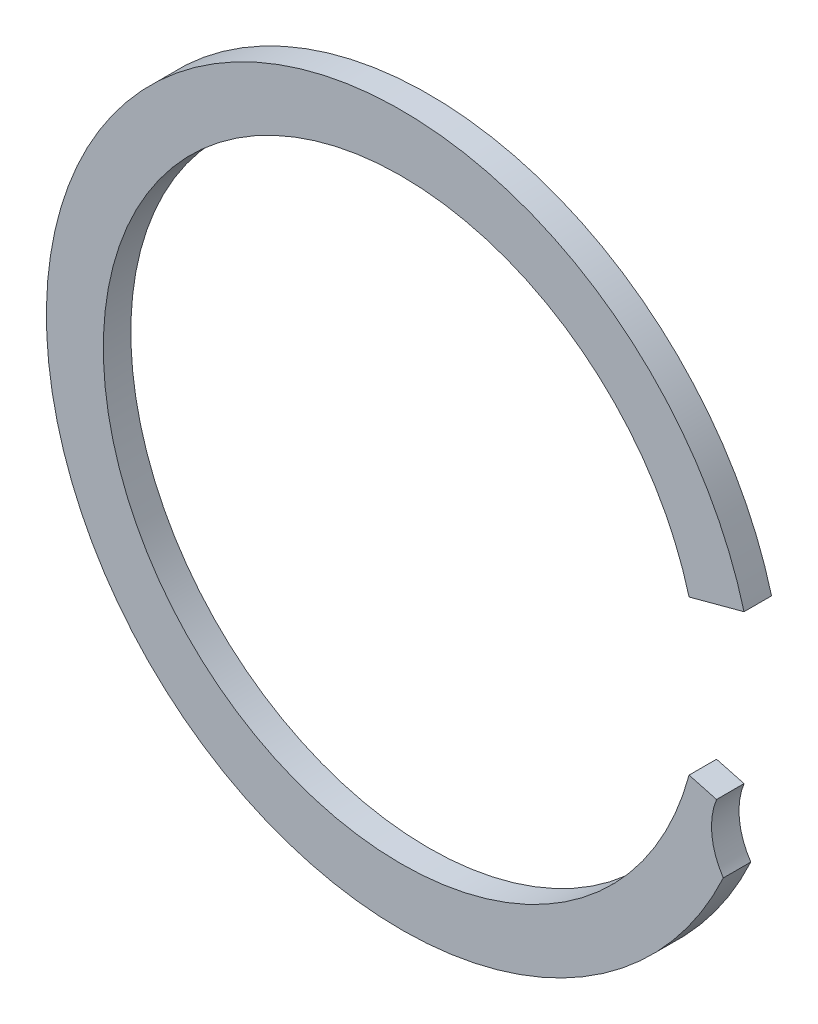
ISO-10303-21;
HEADER;
FILE_DESCRIPTION(('STEP AP214'),'2;1');
FILE_NAME('part.step','',(''),(''),'','','');
FILE_SCHEMA(('AUTOMOTIVE_DESIGN { 1 0 10303 214 1 1 1 1 }'));
ENDSEC;
DATA;
#1=APPLICATION_CONTEXT('core data for automotive mechanical design processes');
#2=APPLICATION_PROTOCOL_DEFINITION('international standard','automotive_design',2000,#1);
#3=PRODUCT_CONTEXT('',#1,'mechanical');
#4=PRODUCT('Part','Part','',(#3));
#5=PRODUCT_RELATED_PRODUCT_CATEGORY('part','',(#4));
#6=PRODUCT_DEFINITION_FORMATION('','',#4);
#7=PRODUCT_DEFINITION_CONTEXT('part definition',#1,'design');
#8=PRODUCT_DEFINITION('design','',#6,#7);
#9=PRODUCT_DEFINITION_SHAPE('','',#8);
#10=(LENGTH_UNIT() NAMED_UNIT(*) SI_UNIT(.MILLI.,.METRE.));
#11=(NAMED_UNIT(*) PLANE_ANGLE_UNIT() SI_UNIT($,.RADIAN.));
#12=(NAMED_UNIT(*) SI_UNIT($,.STERADIAN.) SOLID_ANGLE_UNIT());
#13=UNCERTAINTY_MEASURE_WITH_UNIT(LENGTH_MEASURE(1.E-05),#10,'distance_accuracy_value','');
#14=(GEOMETRIC_REPRESENTATION_CONTEXT(3) GLOBAL_UNCERTAINTY_ASSIGNED_CONTEXT((#13)) GLOBAL_UNIT_ASSIGNED_CONTEXT((#10,
#11,#12)) REPRESENTATION_CONTEXT('',''));
#15=CARTESIAN_POINT('',(0.,0.,0.));
#16=DIRECTION('',(0.,0.,1.));
#17=DIRECTION('',(1.,0.,0.));
#18=AXIS2_PLACEMENT_3D('',#15,#16,#17);
#19=CARTESIAN_POINT('',(15.8561410963895,-4.61857474086869,1.15));
#20=DIRECTION('',(0.,0.,-1.));
#21=DIRECTION('',(-1.,0.,0.));
#22=AXIS2_PLACEMENT_3D('',#19,#20,#21);
#23=CYLINDRICAL_SURFACE('',#22,2.88345777965514);
#24=CARTESIAN_POINT('',(15.8561410963895,-4.61857474086869,0.));
#25=DIRECTION('',(0.,0.,1.));
#26=DIRECTION('',(1.,0.,0.));
#27=AXIS2_PLACEMENT_3D('',#24,#25,#26);
#28=CIRCLE('',#27,2.88345777965514);
#29=CARTESIAN_POINT('',(13.1848875288458,-3.53287996564932,0.));
#30=VERTEX_POINT('',#29);
#31=CARTESIAN_POINT('',(13.467338446686,-6.23348980607277,0.));
#32=VERTEX_POINT('',#31);
#33=EDGE_CURVE('E112',#30,#32,#28,.T.);
#34=ORIENTED_EDGE('',*,*,#33,.F.);
#35=DIRECTION('',(0.,0.,-1.));
#36=VECTOR('',#35,1.);
#37=CARTESIAN_POINT('',(13.1848875288458,-3.53287996564932,1.15));
#38=LINE('',#37,#36);
#39=CARTESIAN_POINT('',(13.1848875288458,-3.53287996564932,1.15));
#40=VERTEX_POINT('',#39);
#41=EDGE_CURVE('E11',#40,#30,#38,.T.);
#42=ORIENTED_EDGE('',*,*,#41,.F.);
#43=CARTESIAN_POINT('',(15.8561410963895,-4.61857474086869,1.15));
#44=DIRECTION('',(0.,0.,1.));
#45=DIRECTION('',(1.,0.,0.));
#46=AXIS2_PLACEMENT_3D('',#43,#44,#45);
#47=CIRCLE('',#46,2.88345777965514);
#48=CARTESIAN_POINT('',(13.467338446686,-6.23348980607277,1.15));
#49=VERTEX_POINT('',#48);
#50=EDGE_CURVE('E107',#40,#49,#47,.T.);
#51=ORIENTED_EDGE('',*,*,#50,.T.);
#52=DIRECTION('',(0.,0.,-1.));
#53=VECTOR('',#52,1.);
#54=CARTESIAN_POINT('',(13.467338446686,-6.23348980607277,1.15));
#55=LINE('',#54,#53);
#56=EDGE_CURVE('E38',#49,#32,#55,.T.);
#57=ORIENTED_EDGE('',*,*,#56,.T.);
#58=EDGE_LOOP('',(#34,#42,#51,#57));
#59=FACE_BOUND('',#58,.T.);
#60=ADVANCED_FACE('F35',(#59),#23,.F.);
#61=CARTESIAN_POINT('',(12.0354357955618,-3.22488530197733,1.15));
#62=DIRECTION('',(0.258819045102516,0.96592582628907,0.));
#63=DIRECTION('',(-0.96592582628907,0.258819045102516,0.));
#64=AXIS2_PLACEMENT_3D('',#61,#62,#63);
#65=PLANE('',#64);
#66=DIRECTION('',(0.96592582628907,-0.258819045102516,0.));
#67=VECTOR('',#66,1.);
#68=CARTESIAN_POINT('',(12.0354357955618,-3.22488530197733,0.));
#69=LINE('',#68,#67);
#70=CARTESIAN_POINT('',(12.0354357955618,-3.22488530197733,0.));
#71=VERTEX_POINT('',#70);
#72=EDGE_CURVE('E121',#71,#30,#69,.T.);
#73=ORIENTED_EDGE('',*,*,#72,.F.);
#74=DIRECTION('',(0.,0.,-1.));
#75=VECTOR('',#74,1.);
#76=CARTESIAN_POINT('',(12.0354357955618,-3.22488530197733,1.15));
#77=LINE('',#76,#75);
#78=CARTESIAN_POINT('',(12.0354357955618,-3.22488530197733,1.15));
#79=VERTEX_POINT('',#78);
#80=EDGE_CURVE('E44',#79,#71,#77,.T.);
#81=ORIENTED_EDGE('',*,*,#80,.F.);
#82=DIRECTION('',(0.96592582628907,-0.258819045102516,0.));
#83=VECTOR('',#82,1.);
#84=CARTESIAN_POINT('',(12.0354357955618,-3.22488530197733,1.15));
#85=LINE('',#84,#83);
#86=EDGE_CURVE('E102',#79,#40,#85,.T.);
#87=ORIENTED_EDGE('',*,*,#86,.T.);
#88=ORIENTED_EDGE('',*,*,#41,.T.);
#89=EDGE_LOOP('',(#73,#81,#87,#88));
#90=FACE_BOUND('',#89,.T.);
#91=ADVANCED_FACE('F127',(#90),#65,.T.);
#92=CARTESIAN_POINT('',(0.,0.,1.15));
#93=DIRECTION('',(0.,0.,-1.));
#94=DIRECTION('',(-1.,0.,0.));
#95=AXIS2_PLACEMENT_3D('',#92,#93,#94);
#96=CYLINDRICAL_SURFACE('',#95,12.46);
#97=CARTESIAN_POINT('',(0.,0.,0.));
#98=DIRECTION('',(0.,0.,1.));
#99=DIRECTION('',(1.,0.,0.));
#100=AXIS2_PLACEMENT_3D('',#97,#98,#99);
#101=CIRCLE('',#100,12.46);
#102=CARTESIAN_POINT('',(12.0354357955618,3.22488530197733,0.));
#103=VERTEX_POINT('',#102);
#104=EDGE_CURVE('E91',#103,#71,#101,.T.);
#105=ORIENTED_EDGE('',*,*,#104,.F.);
#106=DIRECTION('',(0.,0.,-1.));
#107=VECTOR('',#106,1.);
#108=CARTESIAN_POINT('',(12.0354357955618,3.22488530197733,1.15));
#109=LINE('',#108,#107);
#110=CARTESIAN_POINT('',(12.0354357955618,3.22488530197733,1.15));
#111=VERTEX_POINT('',#110);
#112=EDGE_CURVE('E86',#111,#103,#109,.T.);
#113=ORIENTED_EDGE('',*,*,#112,.F.);
#114=CARTESIAN_POINT('',(0.,0.,1.15));
#115=DIRECTION('',(0.,0.,1.));
#116=DIRECTION('',(1.,0.,0.));
#117=AXIS2_PLACEMENT_3D('',#114,#115,#116);
#118=CIRCLE('',#117,12.46);
#119=EDGE_CURVE('E89',#111,#79,#118,.T.);
#120=ORIENTED_EDGE('',*,*,#119,.T.);
#121=ORIENTED_EDGE('',*,*,#80,.T.);
#122=EDGE_LOOP('',(#105,#113,#120,#121));
#123=FACE_BOUND('',#122,.T.);
#124=ADVANCED_FACE('F88',(#123),#96,.F.);
#125=CARTESIAN_POINT('',(14.3343392621298,3.84087462932132,1.15));
#126=DIRECTION('',(0.258819045102514,-0.96592582628907,0.));
#127=DIRECTION('',(0.96592582628907,0.258819045102514,0.));
#128=AXIS2_PLACEMENT_3D('',#125,#126,#127);
#129=PLANE('',#128);
#130=DIRECTION('',(-0.96592582628907,-0.258819045102514,0.));
#131=VECTOR('',#130,1.);
#132=CARTESIAN_POINT('',(14.3343392621298,3.84087462932132,0.));
#133=LINE('',#132,#131);
#134=CARTESIAN_POINT('',(14.3343392621298,3.84087462932133,0.));
#135=VERTEX_POINT('',#134);
#136=EDGE_CURVE('E118',#135,#103,#133,.T.);
#137=ORIENTED_EDGE('',*,*,#136,.F.);
#138=DIRECTION('',(0.,0.,-1.));
#139=VECTOR('',#138,1.);
#140=CARTESIAN_POINT('',(14.3343392621298,3.84087462932133,1.15));
#141=LINE('',#140,#139);
#142=CARTESIAN_POINT('',(14.3343392621298,3.84087462932133,1.15));
#143=VERTEX_POINT('',#142);
#144=EDGE_CURVE('E96',#143,#135,#141,.T.);
#145=ORIENTED_EDGE('',*,*,#144,.F.);
#146=DIRECTION('',(-0.96592582628907,-0.258819045102514,0.));
#147=VECTOR('',#146,1.);
#148=CARTESIAN_POINT('',(14.3343392621298,3.84087462932132,1.15));
#149=LINE('',#148,#147);
#150=EDGE_CURVE('E101',#143,#111,#149,.T.);
#151=ORIENTED_EDGE('',*,*,#150,.T.);
#152=ORIENTED_EDGE('',*,*,#112,.T.);
#153=EDGE_LOOP('',(#137,#145,#151,#152));
#154=FACE_BOUND('',#153,.T.);
#155=ADVANCED_FACE('F104',(#154),#129,.T.);
#156=CARTESIAN_POINT('',(0.,0.,1.15));
#157=DIRECTION('',(0.,0.,-1.));
#158=DIRECTION('',(-1.,0.,0.));
#159=AXIS2_PLACEMENT_3D('',#156,#157,#158);
#160=CYLINDRICAL_SURFACE('',#159,14.84);
#161=CARTESIAN_POINT('',(0.,0.,0.));
#162=DIRECTION('',(0.,0.,-1.));
#163=DIRECTION('',(-1.,0.,0.));
#164=AXIS2_PLACEMENT_3D('',#161,#162,#163);
#165=CIRCLE('',#164,14.84);
#166=EDGE_CURVE('E115',#32,#135,#165,.T.);
#167=ORIENTED_EDGE('',*,*,#166,.F.);
#168=ORIENTED_EDGE('',*,*,#56,.F.);
#169=CARTESIAN_POINT('',(0.,0.,1.15));
#170=DIRECTION('',(0.,0.,-1.));
#171=DIRECTION('',(-1.,0.,0.));
#172=AXIS2_PLACEMENT_3D('',#169,#170,#171);
#173=CIRCLE('',#172,14.84);
#174=EDGE_CURVE('E105',#49,#143,#173,.T.);
#175=ORIENTED_EDGE('',*,*,#174,.T.);
#176=ORIENTED_EDGE('',*,*,#144,.T.);
#177=EDGE_LOOP('',(#167,#168,#175,#176));
#178=FACE_BOUND('',#177,.T.);
#179=ADVANCED_FACE('F124',(#178),#160,.T.);
#180=CARTESIAN_POINT('',(15.8561410963895,-4.61857474086869,1.15));
#181=DIRECTION('',(0.,0.,1.));
#182=DIRECTION('',(1.,0.,0.));
#183=AXIS2_PLACEMENT_3D('',#180,#181,#182);
#184=PLANE('',#183);
#185=ORIENTED_EDGE('',*,*,#50,.F.);
#186=ORIENTED_EDGE('',*,*,#86,.F.);
#187=ORIENTED_EDGE('',*,*,#119,.F.);
#188=ORIENTED_EDGE('',*,*,#150,.F.);
#189=ORIENTED_EDGE('',*,*,#174,.F.);
#190=EDGE_LOOP('',(#185,#186,#187,#188,#189));
#191=FACE_BOUND('',#190,.T.);
#192=ADVANCED_FACE('F100',(#191),#184,.T.);
#193=CARTESIAN_POINT('',(15.8561410963895,-4.61857474086869,0.));
#194=DIRECTION('',(0.,0.,1.));
#195=DIRECTION('',(1.,0.,0.));
#196=AXIS2_PLACEMENT_3D('',#193,#194,#195);
#197=PLANE('',#196);
#198=ORIENTED_EDGE('',*,*,#33,.T.);
#199=ORIENTED_EDGE('',*,*,#166,.T.);
#200=ORIENTED_EDGE('',*,*,#136,.T.);
#201=ORIENTED_EDGE('',*,*,#104,.T.);
#202=ORIENTED_EDGE('',*,*,#72,.T.);
#203=EDGE_LOOP('',(#198,#199,#200,#201,#202));
#204=FACE_BOUND('',#203,.T.);
#205=ADVANCED_FACE('F126',(#204),#197,.F.);
#206=CLOSED_SHELL('',(#60,#91,#124,#155,#179,#192,#205));
#207=MANIFOLD_SOLID_BREP('B2',#206);
#208=ADVANCED_BREP_SHAPE_REPRESENTATION('',(#18,#207),#14);
#209=SHAPE_DEFINITION_REPRESENTATION(#9,#208);
ENDSEC;
END-ISO-10303-21;
